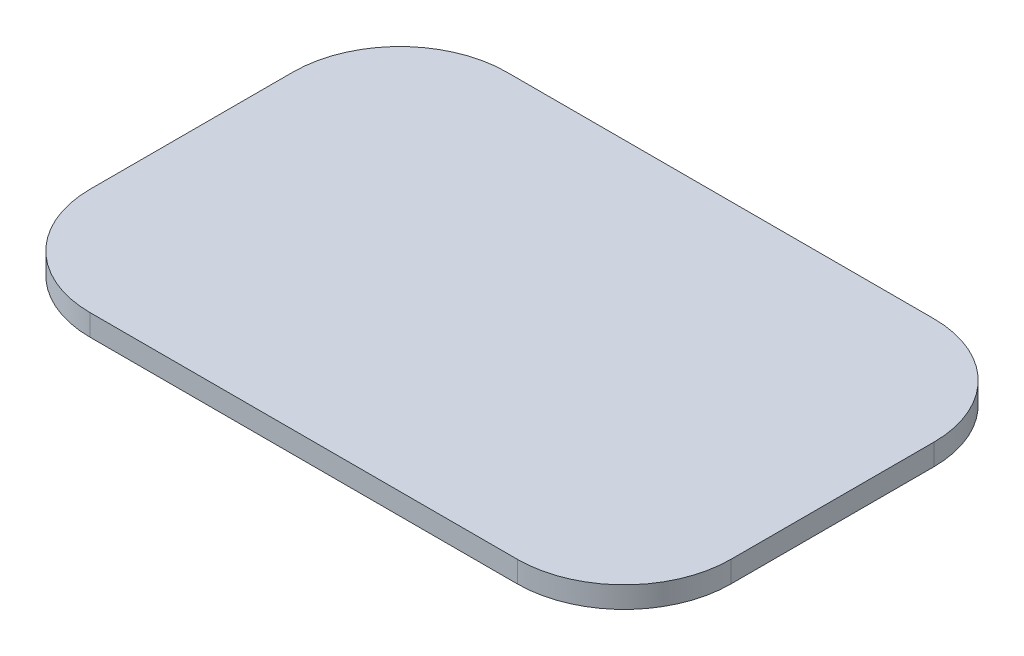
ISO-10303-21;
HEADER;
FILE_DESCRIPTION(('STEP AP214'),'2;1');
FILE_NAME('part.step','',(''),(''),'','','');
FILE_SCHEMA(('AUTOMOTIVE_DESIGN { 1 0 10303 214 1 1 1 1 }'));
ENDSEC;
DATA;
#1=APPLICATION_CONTEXT('core data for automotive mechanical design processes');
#2=APPLICATION_PROTOCOL_DEFINITION('international standard','automotive_design',2000,#1);
#3=PRODUCT_CONTEXT('',#1,'mechanical');
#4=PRODUCT('Part','Part','',(#3));
#5=PRODUCT_RELATED_PRODUCT_CATEGORY('part','',(#4));
#6=PRODUCT_DEFINITION_FORMATION('','',#4);
#7=PRODUCT_DEFINITION_CONTEXT('part definition',#1,'design');
#8=PRODUCT_DEFINITION('design','',#6,#7);
#9=PRODUCT_DEFINITION_SHAPE('','',#8);
#10=(LENGTH_UNIT() NAMED_UNIT(*) SI_UNIT(.MILLI.,.METRE.));
#11=(NAMED_UNIT(*) PLANE_ANGLE_UNIT() SI_UNIT($,.RADIAN.));
#12=(NAMED_UNIT(*) SI_UNIT($,.STERADIAN.) SOLID_ANGLE_UNIT());
#13=UNCERTAINTY_MEASURE_WITH_UNIT(LENGTH_MEASURE(1.E-05),#10,'distance_accuracy_value','');
#14=(GEOMETRIC_REPRESENTATION_CONTEXT(3) GLOBAL_UNCERTAINTY_ASSIGNED_CONTEXT((#13)) GLOBAL_UNIT_ASSIGNED_CONTEXT((#10,
#11,#12)) REPRESENTATION_CONTEXT('',''));
#15=CARTESIAN_POINT('',(0.,0.,0.));
#16=DIRECTION('',(0.,0.,1.));
#17=DIRECTION('',(1.,0.,0.));
#18=AXIS2_PLACEMENT_3D('',#15,#16,#17);
#19=CARTESIAN_POINT('',(-60.,-40.,144.));
#20=DIRECTION('',(0.,0.,1.));
#21=DIRECTION('',(1.,0.,0.));
#22=AXIS2_PLACEMENT_3D('',#19,#20,#21);
#23=PLANE('',#22);
#24=DIRECTION('',(1.,0.,0.));
#25=VECTOR('',#24,1.);
#26=CARTESIAN_POINT('',(-60.,-36.,144.));
#27=LINE('',#26,#25);
#28=CARTESIAN_POINT('',(-40.,-36.,144.));
#29=VERTEX_POINT('',#28);
#30=CARTESIAN_POINT('',(40.,-36.,144.));
#31=VERTEX_POINT('',#30);
#32=EDGE_CURVE('E153',#29,#31,#27,.T.);
#33=ORIENTED_EDGE('',*,*,#32,.F.);
#34=DIRECTION('',(0.,1.,0.));
#35=VECTOR('',#34,1.);
#36=CARTESIAN_POINT('',(-40.,-40.,144.));
#37=LINE('',#36,#35);
#38=CARTESIAN_POINT('',(-40.,-40.,144.));
#39=VERTEX_POINT('',#38);
#40=EDGE_CURVE('E111',#39,#29,#37,.T.);
#41=ORIENTED_EDGE('',*,*,#40,.F.);
#42=DIRECTION('',(1.,0.,0.));
#43=VECTOR('',#42,1.);
#44=CARTESIAN_POINT('',(-60.,-40.,144.));
#45=LINE('',#44,#43);
#46=CARTESIAN_POINT('',(40.,-40.,144.));
#47=VERTEX_POINT('',#46);
#48=EDGE_CURVE('E109',#39,#47,#45,.T.);
#49=ORIENTED_EDGE('',*,*,#48,.T.);
#50=DIRECTION('',(0.,1.,0.));
#51=VECTOR('',#50,1.);
#52=CARTESIAN_POINT('',(40.,-40.,144.));
#53=LINE('',#52,#51);
#54=EDGE_CURVE('E10',#47,#31,#53,.T.);
#55=ORIENTED_EDGE('',*,*,#54,.T.);
#56=EDGE_LOOP('',(#33,#41,#49,#55));
#57=FACE_BOUND('',#56,.T.);
#58=ADVANCED_FACE('F16',(#57),#23,.T.);
#59=CARTESIAN_POINT('',(40.,-40.,124.));
#60=DIRECTION('',(0.,1.,0.));
#61=DIRECTION('',(1.,0.,0.));
#62=AXIS2_PLACEMENT_3D('',#59,#60,#61);
#63=CYLINDRICAL_SURFACE('',#62,20.);
#64=DIRECTION('',(0.,1.,0.));
#65=VECTOR('',#64,1.);
#66=CARTESIAN_POINT('',(60.,-40.,124.));
#67=LINE('',#66,#65);
#68=CARTESIAN_POINT('',(60.,-40.,124.));
#69=VERTEX_POINT('',#68);
#70=CARTESIAN_POINT('',(60.,-36.,124.));
#71=VERTEX_POINT('',#70);
#72=EDGE_CURVE('E25',#69,#71,#67,.T.);
#73=ORIENTED_EDGE('',*,*,#72,.T.);
#74=CARTESIAN_POINT('',(40.,-36.,124.));
#75=DIRECTION('',(0.,-1.,0.));
#76=DIRECTION('',(0.,0.,1.));
#77=AXIS2_PLACEMENT_3D('',#74,#75,#76);
#78=CIRCLE('',#77,20.);
#79=EDGE_CURVE('E105',#71,#31,#78,.T.);
#80=ORIENTED_EDGE('',*,*,#79,.T.);
#81=ORIENTED_EDGE('',*,*,#54,.F.);
#82=CARTESIAN_POINT('',(40.,-40.,124.));
#83=DIRECTION('',(0.,-1.,0.));
#84=DIRECTION('',(0.,0.,1.));
#85=AXIS2_PLACEMENT_3D('',#82,#83,#84);
#86=CIRCLE('',#85,20.);
#87=EDGE_CURVE('E102',#69,#47,#86,.T.);
#88=ORIENTED_EDGE('',*,*,#87,.F.);
#89=EDGE_LOOP('',(#73,#80,#81,#88));
#90=FACE_BOUND('',#89,.T.);
#91=ADVANCED_FACE('F18',(#90),#63,.T.);
#92=CARTESIAN_POINT('',(60.,-40.,66.));
#93=DIRECTION('',(1.,0.,0.));
#94=DIRECTION('',(0.,1.,0.));
#95=AXIS2_PLACEMENT_3D('',#92,#93,#94);
#96=PLANE('',#95);
#97=DIRECTION('',(0.,0.,1.));
#98=VECTOR('',#97,1.);
#99=CARTESIAN_POINT('',(60.,-40.,66.));
#100=LINE('',#99,#98);
#101=CARTESIAN_POINT('',(60.,-40.,86.));
#102=VERTEX_POINT('',#101);
#103=EDGE_CURVE('E119',#102,#69,#100,.T.);
#104=ORIENTED_EDGE('',*,*,#103,.F.);
#105=DIRECTION('',(0.,1.,0.));
#106=VECTOR('',#105,1.);
#107=CARTESIAN_POINT('',(60.,-40.,86.));
#108=LINE('',#107,#106);
#109=CARTESIAN_POINT('',(60.,-36.,86.));
#110=VERTEX_POINT('',#109);
#111=EDGE_CURVE('E37',#102,#110,#108,.T.);
#112=ORIENTED_EDGE('',*,*,#111,.T.);
#113=DIRECTION('',(0.,0.,1.));
#114=VECTOR('',#113,1.);
#115=CARTESIAN_POINT('',(60.,-36.,66.));
#116=LINE('',#115,#114);
#117=EDGE_CURVE('E158',#110,#71,#116,.T.);
#118=ORIENTED_EDGE('',*,*,#117,.T.);
#119=ORIENTED_EDGE('',*,*,#72,.F.);
#120=EDGE_LOOP('',(#104,#112,#118,#119));
#121=FACE_BOUND('',#120,.T.);
#122=ADVANCED_FACE('F283',(#121),#96,.T.);
#123=CARTESIAN_POINT('',(40.,-40.,86.));
#124=DIRECTION('',(0.,1.,0.));
#125=DIRECTION('',(1.,0.,0.));
#126=AXIS2_PLACEMENT_3D('',#123,#124,#125);
#127=CYLINDRICAL_SURFACE('',#126,20.);
#128=CARTESIAN_POINT('',(40.,-40.,86.));
#129=DIRECTION('',(0.,1.,0.));
#130=DIRECTION('',(0.,0.,1.));
#131=AXIS2_PLACEMENT_3D('',#128,#129,#130);
#132=CIRCLE('',#131,20.);
#133=CARTESIAN_POINT('',(40.,-40.,66.));
#134=VERTEX_POINT('',#133);
#135=EDGE_CURVE('E126',#102,#134,#132,.T.);
#136=ORIENTED_EDGE('',*,*,#135,.T.);
#137=DIRECTION('',(0.,1.,0.));
#138=VECTOR('',#137,1.);
#139=CARTESIAN_POINT('',(40.,-40.,66.));
#140=LINE('',#139,#138);
#141=CARTESIAN_POINT('',(40.,-36.,66.));
#142=VERTEX_POINT('',#141);
#143=EDGE_CURVE('E143',#134,#142,#140,.T.);
#144=ORIENTED_EDGE('',*,*,#143,.T.);
#145=CARTESIAN_POINT('',(40.,-36.,86.));
#146=DIRECTION('',(0.,1.,0.));
#147=DIRECTION('',(0.,0.,1.));
#148=AXIS2_PLACEMENT_3D('',#145,#146,#147);
#149=CIRCLE('',#148,20.);
#150=EDGE_CURVE('E161',#110,#142,#149,.T.);
#151=ORIENTED_EDGE('',*,*,#150,.F.);
#152=ORIENTED_EDGE('',*,*,#111,.F.);
#153=EDGE_LOOP('',(#136,#144,#151,#152));
#154=FACE_BOUND('',#153,.T.);
#155=ADVANCED_FACE('F281',(#154),#127,.T.);
#156=CARTESIAN_POINT('',(-60.,-40.,66.));
#157=DIRECTION('',(0.,0.,1.));
#158=DIRECTION('',(1.,0.,0.));
#159=AXIS2_PLACEMENT_3D('',#156,#157,#158);
#160=PLANE('',#159);
#161=ORIENTED_EDGE('',*,*,#143,.F.);
#162=DIRECTION('',(1.,0.,0.));
#163=VECTOR('',#162,1.);
#164=CARTESIAN_POINT('',(-60.,-40.,66.));
#165=LINE('',#164,#163);
#166=CARTESIAN_POINT('',(-40.,-40.,66.));
#167=VERTEX_POINT('',#166);
#168=EDGE_CURVE('E136',#167,#134,#165,.T.);
#169=ORIENTED_EDGE('',*,*,#168,.F.);
#170=DIRECTION('',(0.,1.,0.));
#171=VECTOR('',#170,1.);
#172=CARTESIAN_POINT('',(-40.,-40.,66.));
#173=LINE('',#172,#171);
#174=CARTESIAN_POINT('',(-40.,-36.,66.));
#175=VERTEX_POINT('',#174);
#176=EDGE_CURVE('E144',#167,#175,#173,.T.);
#177=ORIENTED_EDGE('',*,*,#176,.T.);
#178=DIRECTION('',(1.,0.,0.));
#179=VECTOR('',#178,1.);
#180=CARTESIAN_POINT('',(-60.,-36.,66.));
#181=LINE('',#180,#179);
#182=EDGE_CURVE('E152',#175,#142,#181,.T.);
#183=ORIENTED_EDGE('',*,*,#182,.T.);
#184=EDGE_LOOP('',(#161,#169,#177,#183));
#185=FACE_BOUND('',#184,.T.);
#186=ADVANCED_FACE('F284',(#185),#160,.F.);
#187=CARTESIAN_POINT('',(-60.,-36.,66.));
#188=DIRECTION('',(0.,1.,0.));
#189=DIRECTION('',(1.,0.,0.));
#190=AXIS2_PLACEMENT_3D('',#187,#188,#189);
#191=PLANE('',#190);
#192=ORIENTED_EDGE('',*,*,#182,.F.);
#193=CARTESIAN_POINT('',(-40.,-36.,86.));
#194=DIRECTION('',(0.,-1.,0.));
#195=DIRECTION('',(0.,0.,1.));
#196=AXIS2_PLACEMENT_3D('',#193,#194,#195);
#197=CIRCLE('',#196,20.);
#198=CARTESIAN_POINT('',(-60.,-36.,86.));
#199=VERTEX_POINT('',#198);
#200=EDGE_CURVE('E140',#199,#175,#197,.T.);
#201=ORIENTED_EDGE('',*,*,#200,.F.);
#202=DIRECTION('',(0.,0.,1.));
#203=VECTOR('',#202,1.);
#204=CARTESIAN_POINT('',(-60.,-36.,66.));
#205=LINE('',#204,#203);
#206=CARTESIAN_POINT('',(-60.,-36.,124.));
#207=VERTEX_POINT('',#206);
#208=EDGE_CURVE('E253',#199,#207,#205,.T.);
#209=ORIENTED_EDGE('',*,*,#208,.T.);
#210=CARTESIAN_POINT('',(-40.,-36.,124.));
#211=DIRECTION('',(0.,1.,0.));
#212=DIRECTION('',(0.,0.,1.));
#213=AXIS2_PLACEMENT_3D('',#210,#211,#212);
#214=CIRCLE('',#213,20.);
#215=EDGE_CURVE('E148',#207,#29,#214,.T.);
#216=ORIENTED_EDGE('',*,*,#215,.T.);
#217=ORIENTED_EDGE('',*,*,#32,.T.);
#218=ORIENTED_EDGE('',*,*,#79,.F.);
#219=ORIENTED_EDGE('',*,*,#117,.F.);
#220=ORIENTED_EDGE('',*,*,#150,.T.);
#221=EDGE_LOOP('',(#192,#201,#209,#216,#217,#218,#219,#220));
#222=FACE_BOUND('',#221,.T.);
#223=ADVANCED_FACE('F275',(#222),#191,.T.);
#224=CARTESIAN_POINT('',(-40.,-40.,124.));
#225=DIRECTION('',(0.,1.,0.));
#226=DIRECTION('',(-1.,0.,0.));
#227=AXIS2_PLACEMENT_3D('',#224,#225,#226);
#228=CYLINDRICAL_SURFACE('',#227,20.);
#229=CARTESIAN_POINT('',(-40.,-40.,124.));
#230=DIRECTION('',(0.,1.,0.));
#231=DIRECTION('',(0.,0.,1.));
#232=AXIS2_PLACEMENT_3D('',#229,#230,#231);
#233=CIRCLE('',#232,20.);
#234=CARTESIAN_POINT('',(-60.,-40.,124.));
#235=VERTEX_POINT('',#234);
#236=EDGE_CURVE('E115',#235,#39,#233,.T.);
#237=ORIENTED_EDGE('',*,*,#236,.T.);
#238=ORIENTED_EDGE('',*,*,#40,.T.);
#239=ORIENTED_EDGE('',*,*,#215,.F.);
#240=DIRECTION('',(0.,1.,0.));
#241=VECTOR('',#240,1.);
#242=CARTESIAN_POINT('',(-60.,-40.,124.));
#243=LINE('',#242,#241);
#244=EDGE_CURVE('E259',#235,#207,#243,.T.);
#245=ORIENTED_EDGE('',*,*,#244,.F.);
#246=EDGE_LOOP('',(#237,#238,#239,#245));
#247=FACE_BOUND('',#246,.T.);
#248=ADVANCED_FACE('F273',(#247),#228,.T.);
#249=CARTESIAN_POINT('',(-40.,-40.,86.));
#250=DIRECTION('',(0.,1.,0.));
#251=DIRECTION('',(-1.,0.,0.));
#252=AXIS2_PLACEMENT_3D('',#249,#250,#251);
#253=CYLINDRICAL_SURFACE('',#252,20.);
#254=DIRECTION('',(0.,1.,0.));
#255=VECTOR('',#254,1.);
#256=CARTESIAN_POINT('',(-60.,-40.,86.));
#257=LINE('',#256,#255);
#258=CARTESIAN_POINT('',(-60.,-40.,86.));
#259=VERTEX_POINT('',#258);
#260=EDGE_CURVE('E247',#259,#199,#257,.T.);
#261=ORIENTED_EDGE('',*,*,#260,.T.);
#262=ORIENTED_EDGE('',*,*,#200,.T.);
#263=ORIENTED_EDGE('',*,*,#176,.F.);
#264=CARTESIAN_POINT('',(-40.,-40.,86.));
#265=DIRECTION('',(0.,-1.,0.));
#266=DIRECTION('',(0.,0.,1.));
#267=AXIS2_PLACEMENT_3D('',#264,#265,#266);
#268=CIRCLE('',#267,20.);
#269=EDGE_CURVE('E132',#259,#167,#268,.T.);
#270=ORIENTED_EDGE('',*,*,#269,.F.);
#271=EDGE_LOOP('',(#261,#262,#263,#270));
#272=FACE_BOUND('',#271,.T.);
#273=ADVANCED_FACE('F277',(#272),#253,.T.);
#274=CARTESIAN_POINT('',(-60.,-40.,66.));
#275=DIRECTION('',(0.,1.,0.));
#276=DIRECTION('',(1.,0.,0.));
#277=AXIS2_PLACEMENT_3D('',#274,#275,#276);
#278=PLANE('',#277);
#279=ORIENTED_EDGE('',*,*,#135,.F.);
#280=ORIENTED_EDGE('',*,*,#103,.T.);
#281=ORIENTED_EDGE('',*,*,#87,.T.);
#282=ORIENTED_EDGE('',*,*,#48,.F.);
#283=ORIENTED_EDGE('',*,*,#236,.F.);
#284=DIRECTION('',(0.,0.,1.));
#285=VECTOR('',#284,1.);
#286=CARTESIAN_POINT('',(-60.,-40.,66.));
#287=LINE('',#286,#285);
#288=EDGE_CURVE('E241',#259,#235,#287,.T.);
#289=ORIENTED_EDGE('',*,*,#288,.F.);
#290=ORIENTED_EDGE('',*,*,#269,.T.);
#291=ORIENTED_EDGE('',*,*,#168,.T.);
#292=EDGE_LOOP('',(#279,#280,#281,#282,#283,#289,#290,#291));
#293=FACE_BOUND('',#292,.T.);
#294=ADVANCED_FACE('F118',(#293),#278,.F.);
#295=CARTESIAN_POINT('',(-60.,-40.,66.));
#296=DIRECTION('',(1.,0.,0.));
#297=DIRECTION('',(0.,1.,0.));
#298=AXIS2_PLACEMENT_3D('',#295,#296,#297);
#299=PLANE('',#298);
#300=ORIENTED_EDGE('',*,*,#244,.T.);
#301=ORIENTED_EDGE('',*,*,#208,.F.);
#302=ORIENTED_EDGE('',*,*,#260,.F.);
#303=ORIENTED_EDGE('',*,*,#288,.T.);
#304=EDGE_LOOP('',(#300,#301,#302,#303));
#305=FACE_BOUND('',#304,.T.);
#306=ADVANCED_FACE('F269',(#305),#299,.F.);
#307=CLOSED_SHELL('',(#58,#91,#122,#155,#186,#223,#248,#273,#294,#306));
#308=MANIFOLD_SOLID_BREP('B1',#307);
#309=ADVANCED_BREP_SHAPE_REPRESENTATION('',(#18,#308),#14);
#310=SHAPE_DEFINITION_REPRESENTATION(#9,#309);
ENDSEC;
END-ISO-10303-21;
